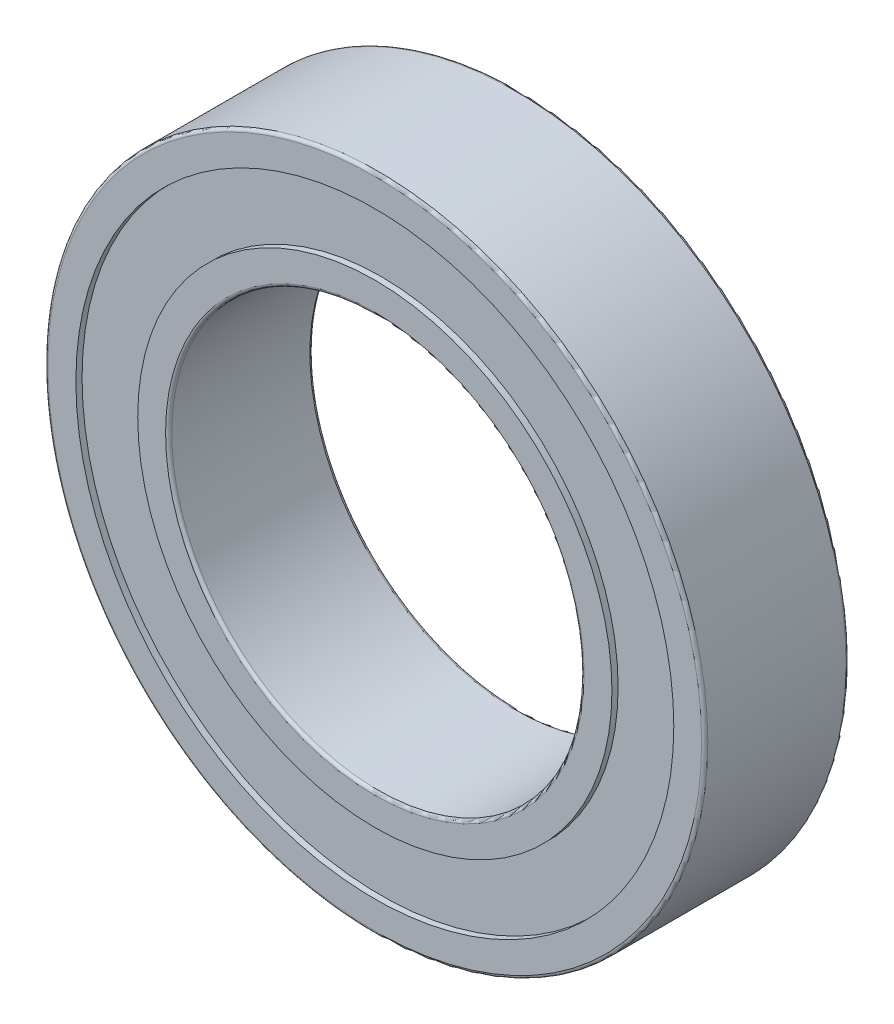
ISO-10303-21;
HEADER;
FILE_DESCRIPTION(('STEP AP214'),'2;1');
FILE_NAME('part.step','',(''),(''),'','','');
FILE_SCHEMA(('AUTOMOTIVE_DESIGN { 1 0 10303 214 1 1 1 1 }'));
ENDSEC;
DATA;
#1=APPLICATION_CONTEXT('core data for automotive mechanical design processes');
#2=APPLICATION_PROTOCOL_DEFINITION('international standard','automotive_design',2000,#1);
#3=PRODUCT_CONTEXT('',#1,'mechanical');
#4=PRODUCT('Part','Part','',(#3));
#5=PRODUCT_RELATED_PRODUCT_CATEGORY('part','',(#4));
#6=PRODUCT_DEFINITION_FORMATION('','',#4);
#7=PRODUCT_DEFINITION_CONTEXT('part definition',#1,'design');
#8=PRODUCT_DEFINITION('design','',#6,#7);
#9=PRODUCT_DEFINITION_SHAPE('','',#8);
#10=(LENGTH_UNIT() NAMED_UNIT(*) SI_UNIT(.MILLI.,.METRE.));
#11=(NAMED_UNIT(*) PLANE_ANGLE_UNIT() SI_UNIT($,.RADIAN.));
#12=(NAMED_UNIT(*) SI_UNIT($,.STERADIAN.) SOLID_ANGLE_UNIT());
#13=UNCERTAINTY_MEASURE_WITH_UNIT(LENGTH_MEASURE(1.E-05),#10,'distance_accuracy_value','');
#14=(GEOMETRIC_REPRESENTATION_CONTEXT(3) GLOBAL_UNCERTAINTY_ASSIGNED_CONTEXT((#13)) GLOBAL_UNIT_ASSIGNED_CONTEXT((#10,
#11,#12)) REPRESENTATION_CONTEXT('',''));
#15=CARTESIAN_POINT('',(0.,0.,0.));
#16=DIRECTION('',(0.,0.,1.));
#17=DIRECTION('',(1.,0.,0.));
#18=AXIS2_PLACEMENT_3D('',#15,#16,#17);
#19=CARTESIAN_POINT('',(0.,0.,0.));
#20=DIRECTION('',(0.,0.,1.));
#21=DIRECTION('',(1.,0.,0.));
#22=AXIS2_PLACEMENT_3D('',#19,#20,#21);
#23=PLANE('',#22);
#24=CARTESIAN_POINT('',(0.,0.,0.));
#25=DIRECTION('',(0.,0.,1.));
#26=DIRECTION('',(1.,0.,0.));
#27=AXIS2_PLACEMENT_3D('',#24,#25,#26);
#28=CIRCLE('',#27,10.15);
#29=CARTESIAN_POINT('',(10.15,0.,0.));
#30=VERTEX_POINT('',#29);
#31=EDGE_CURVE('E62',#30,#30,#28,.T.);
#32=ORIENTED_EDGE('',*,*,#31,.T.);
#33=EDGE_LOOP('',(#32));
#34=FACE_BOUND('',#33,.T.);
#35=CARTESIAN_POINT('',(0.,0.,0.));
#36=DIRECTION('',(0.,0.,1.));
#37=DIRECTION('',(1.,0.,0.));
#38=AXIS2_PLACEMENT_3D('',#35,#36,#37);
#39=CIRCLE('',#38,11.5);
#40=CARTESIAN_POINT('',(11.5,0.,0.));
#41=VERTEX_POINT('',#40);
#42=EDGE_CURVE('E84',#41,#41,#39,.T.);
#43=ORIENTED_EDGE('',*,*,#42,.F.);
#44=EDGE_LOOP('',(#43));
#45=FACE_BOUND('',#44,.T.);
#46=ADVANCED_FACE('F33',(#34,#45),#23,.F.);
#47=CARTESIAN_POINT('',(0.,0.,7.));
#48=DIRECTION('',(0.,0.,1.));
#49=DIRECTION('',(1.,0.,0.));
#50=AXIS2_PLACEMENT_3D('',#47,#48,#49);
#51=PLANE('',#50);
#52=CARTESIAN_POINT('',(0.,0.,7.));
#53=DIRECTION('',(0.,0.,1.));
#54=DIRECTION('',(1.,0.,0.));
#55=AXIS2_PLACEMENT_3D('',#52,#53,#54);
#56=CIRCLE('',#55,10.15);
#57=CARTESIAN_POINT('',(10.15,0.,7.));
#58=VERTEX_POINT('',#57);
#59=EDGE_CURVE('E40',#58,#58,#56,.F.);
#60=ORIENTED_EDGE('',*,*,#59,.T.);
#61=EDGE_LOOP('',(#60));
#62=FACE_BOUND('',#61,.T.);
#63=CARTESIAN_POINT('',(0.,0.,7.));
#64=DIRECTION('',(0.,0.,1.));
#65=DIRECTION('',(1.,0.,0.));
#66=AXIS2_PLACEMENT_3D('',#63,#64,#65);
#67=CIRCLE('',#66,11.5);
#68=CARTESIAN_POINT('',(11.5,0.,7.));
#69=VERTEX_POINT('',#68);
#70=EDGE_CURVE('E72',#69,#69,#67,.T.);
#71=ORIENTED_EDGE('',*,*,#70,.T.);
#72=EDGE_LOOP('',(#71));
#73=FACE_BOUND('',#72,.T.);
#74=ADVANCED_FACE('F101',(#62,#73),#51,.T.);
#75=CARTESIAN_POINT('',(0.,0.,7.));
#76=DIRECTION('',(0.,0.,1.));
#77=DIRECTION('',(1.,0.,0.));
#78=AXIS2_PLACEMENT_3D('',#75,#76,#77);
#79=CIRCLE('',#78,15.85);
#80=CARTESIAN_POINT('',(15.85,0.,7.));
#81=VERTEX_POINT('',#80);
#82=EDGE_CURVE('E10',#81,#81,#79,.T.);
#83=ORIENTED_EDGE('',*,*,#82,.T.);
#84=EDGE_LOOP('',(#83));
#85=FACE_BOUND('',#84,.T.);
#86=CARTESIAN_POINT('',(0.,0.,7.));
#87=DIRECTION('',(0.,0.,1.));
#88=DIRECTION('',(1.,0.,0.));
#89=AXIS2_PLACEMENT_3D('',#86,#87,#88);
#90=CIRCLE('',#89,14.5);
#91=CARTESIAN_POINT('',(14.5,0.,7.));
#92=VERTEX_POINT('',#91);
#93=EDGE_CURVE('E66',#92,#92,#90,.T.);
#94=ORIENTED_EDGE('',*,*,#93,.F.);
#95=EDGE_LOOP('',(#94));
#96=FACE_BOUND('',#95,.T.);
#97=ADVANCED_FACE('F108',(#85,#96),#51,.T.);
#98=CARTESIAN_POINT('',(0.,0.,0.));
#99=DIRECTION('',(0.,0.,1.));
#100=DIRECTION('',(1.,0.,0.));
#101=AXIS2_PLACEMENT_3D('',#98,#99,#100);
#102=CIRCLE('',#101,15.85);
#103=CARTESIAN_POINT('',(15.85,0.,0.));
#104=VERTEX_POINT('',#103);
#105=EDGE_CURVE('E44',#104,#104,#102,.F.);
#106=ORIENTED_EDGE('',*,*,#105,.T.);
#107=EDGE_LOOP('',(#106));
#108=FACE_BOUND('',#107,.T.);
#109=CARTESIAN_POINT('',(0.,0.,0.));
#110=DIRECTION('',(0.,0.,1.));
#111=DIRECTION('',(1.,0.,0.));
#112=AXIS2_PLACEMENT_3D('',#109,#110,#111);
#113=CIRCLE('',#112,14.5);
#114=CARTESIAN_POINT('',(14.5,0.,0.));
#115=VERTEX_POINT('',#114);
#116=EDGE_CURVE('E78',#115,#115,#113,.T.);
#117=ORIENTED_EDGE('',*,*,#116,.T.);
#118=EDGE_LOOP('',(#117));
#119=FACE_BOUND('',#118,.T.);
#120=ADVANCED_FACE('F104',(#108,#119),#23,.F.);
#121=CARTESIAN_POINT('',(0.,0.,7.));
#122=DIRECTION('',(0.,0.,-1.));
#123=DIRECTION('',(-1.,0.,0.));
#124=AXIS2_PLACEMENT_3D('',#121,#122,#123);
#125=CYLINDRICAL_SURFACE('',#124,16.);
#126=CARTESIAN_POINT('',(0.,0.,0.15));
#127=DIRECTION('',(0.,0.,1.));
#128=DIRECTION('',(1.,0.,0.));
#129=AXIS2_PLACEMENT_3D('',#126,#127,#128);
#130=CIRCLE('',#129,16.);
#131=CARTESIAN_POINT('',(16.,0.,0.15));
#132=VERTEX_POINT('',#131);
#133=EDGE_CURVE('E48',#132,#132,#130,.T.);
#134=ORIENTED_EDGE('',*,*,#133,.T.);
#135=EDGE_LOOP('',(#134));
#136=FACE_BOUND('',#135,.T.);
#137=CARTESIAN_POINT('',(0.,0.,6.85));
#138=DIRECTION('',(0.,0.,1.));
#139=DIRECTION('',(1.,0.,0.));
#140=AXIS2_PLACEMENT_3D('',#137,#138,#139);
#141=CIRCLE('',#140,16.);
#142=CARTESIAN_POINT('',(16.,0.,6.85));
#143=VERTEX_POINT('',#142);
#144=EDGE_CURVE('E53',#143,#143,#141,.F.);
#145=ORIENTED_EDGE('',*,*,#144,.T.);
#146=EDGE_LOOP('',(#145));
#147=FACE_BOUND('',#146,.T.);
#148=ADVANCED_FACE('F112',(#136,#147),#125,.T.);
#149=CARTESIAN_POINT('',(0.,0.,7.));
#150=DIRECTION('',(0.,0.,-1.));
#151=DIRECTION('',(-1.,0.,0.));
#152=AXIS2_PLACEMENT_3D('',#149,#150,#151);
#153=CYLINDRICAL_SURFACE('',#152,10.);
#154=CARTESIAN_POINT('',(0.,0.,0.15));
#155=DIRECTION('',(0.,0.,1.));
#156=DIRECTION('',(1.,0.,0.));
#157=AXIS2_PLACEMENT_3D('',#154,#155,#156);
#158=CIRCLE('',#157,10.);
#159=CARTESIAN_POINT('',(10.,0.,0.15));
#160=VERTEX_POINT('',#159);
#161=EDGE_CURVE('E56',#160,#160,#158,.F.);
#162=ORIENTED_EDGE('',*,*,#161,.T.);
#163=EDGE_LOOP('',(#162));
#164=FACE_BOUND('',#163,.T.);
#165=CARTESIAN_POINT('',(0.,0.,6.85));
#166=DIRECTION('',(0.,0.,1.));
#167=DIRECTION('',(1.,0.,0.));
#168=AXIS2_PLACEMENT_3D('',#165,#166,#167);
#169=CIRCLE('',#168,10.);
#170=CARTESIAN_POINT('',(10.,0.,6.85));
#171=VERTEX_POINT('',#170);
#172=EDGE_CURVE('E59',#171,#171,#169,.T.);
#173=ORIENTED_EDGE('',*,*,#172,.T.);
#174=EDGE_LOOP('',(#173));
#175=FACE_BOUND('',#174,.T.);
#176=ADVANCED_FACE('F118',(#164,#175),#153,.F.);
#177=CARTESIAN_POINT('',(0.,0.,6.7));
#178=DIRECTION('',(0.,0.,1.));
#179=DIRECTION('',(1.,0.,0.));
#180=AXIS2_PLACEMENT_3D('',#177,#178,#179);
#181=CYLINDRICAL_SURFACE('',#180,14.5);
#182=CARTESIAN_POINT('',(0.,0.,6.7));
#183=DIRECTION('',(0.,0.,1.));
#184=DIRECTION('',(1.,0.,0.));
#185=AXIS2_PLACEMENT_3D('',#182,#183,#184);
#186=CIRCLE('',#185,14.5);
#187=CARTESIAN_POINT('',(14.5,0.,6.7));
#188=VERTEX_POINT('',#187);
#189=EDGE_CURVE('E65',#188,#188,#186,.T.);
#190=ORIENTED_EDGE('',*,*,#189,.F.);
#191=EDGE_LOOP('',(#190));
#192=FACE_BOUND('',#191,.T.);
#193=ORIENTED_EDGE('',*,*,#93,.T.);
#194=EDGE_LOOP('',(#193));
#195=FACE_BOUND('',#194,.T.);
#196=ADVANCED_FACE('F140',(#192,#195),#181,.F.);
#197=CARTESIAN_POINT('',(0.,0.,6.7));
#198=DIRECTION('',(0.,0.,1.));
#199=DIRECTION('',(1.,0.,0.));
#200=AXIS2_PLACEMENT_3D('',#197,#198,#199);
#201=PLANE('',#200);
#202=CARTESIAN_POINT('',(0.,0.,6.7));
#203=DIRECTION('',(0.,0.,1.));
#204=DIRECTION('',(1.,0.,0.));
#205=AXIS2_PLACEMENT_3D('',#202,#203,#204);
#206=CIRCLE('',#205,11.5);
#207=CARTESIAN_POINT('',(11.5,0.,6.7));
#208=VERTEX_POINT('',#207);
#209=EDGE_CURVE('E69',#208,#208,#206,.T.);
#210=ORIENTED_EDGE('',*,*,#209,.F.);
#211=EDGE_LOOP('',(#210));
#212=FACE_BOUND('',#211,.T.);
#213=ORIENTED_EDGE('',*,*,#189,.T.);
#214=EDGE_LOOP('',(#213));
#215=FACE_BOUND('',#214,.T.);
#216=ADVANCED_FACE('F136',(#212,#215),#201,.T.);
#217=CARTESIAN_POINT('',(0.,0.,6.7));
#218=DIRECTION('',(0.,0.,1.));
#219=DIRECTION('',(1.,0.,0.));
#220=AXIS2_PLACEMENT_3D('',#217,#218,#219);
#221=CYLINDRICAL_SURFACE('',#220,11.5);
#222=ORIENTED_EDGE('',*,*,#209,.T.);
#223=EDGE_LOOP('',(#222));
#224=FACE_BOUND('',#223,.T.);
#225=ORIENTED_EDGE('',*,*,#70,.F.);
#226=EDGE_LOOP('',(#225));
#227=FACE_BOUND('',#226,.T.);
#228=ADVANCED_FACE('F130',(#224,#227),#221,.T.);
#229=CARTESIAN_POINT('',(0.,0.,0.5));
#230=DIRECTION('',(0.,0.,1.));
#231=DIRECTION('',(1.,0.,0.));
#232=AXIS2_PLACEMENT_3D('',#229,#230,#231);
#233=PLANE('',#232);
#234=CARTESIAN_POINT('',(0.,0.,0.5));
#235=DIRECTION('',(0.,0.,1.));
#236=DIRECTION('',(1.,0.,0.));
#237=AXIS2_PLACEMENT_3D('',#234,#235,#236);
#238=CIRCLE('',#237,14.5);
#239=CARTESIAN_POINT('',(14.5,0.,0.5));
#240=VERTEX_POINT('',#239);
#241=EDGE_CURVE('E75',#240,#240,#238,.T.);
#242=ORIENTED_EDGE('',*,*,#241,.F.);
#243=EDGE_LOOP('',(#242));
#244=FACE_BOUND('',#243,.T.);
#245=CARTESIAN_POINT('',(0.,0.,0.5));
#246=DIRECTION('',(0.,0.,1.));
#247=DIRECTION('',(1.,0.,0.));
#248=AXIS2_PLACEMENT_3D('',#245,#246,#247);
#249=CIRCLE('',#248,11.5);
#250=CARTESIAN_POINT('',(11.5,0.,0.5));
#251=VERTEX_POINT('',#250);
#252=EDGE_CURVE('E81',#251,#251,#249,.T.);
#253=ORIENTED_EDGE('',*,*,#252,.T.);
#254=EDGE_LOOP('',(#253));
#255=FACE_BOUND('',#254,.T.);
#256=ADVANCED_FACE('F90',(#244,#255),#233,.F.);
#257=CARTESIAN_POINT('',(0.,0.,0.5));
#258=DIRECTION('',(0.,0.,-1.));
#259=DIRECTION('',(-1.,0.,0.));
#260=AXIS2_PLACEMENT_3D('',#257,#258,#259);
#261=CYLINDRICAL_SURFACE('',#260,14.5);
#262=ORIENTED_EDGE('',*,*,#241,.T.);
#263=EDGE_LOOP('',(#262));
#264=FACE_BOUND('',#263,.T.);
#265=ORIENTED_EDGE('',*,*,#116,.F.);
#266=EDGE_LOOP('',(#265));
#267=FACE_BOUND('',#266,.T.);
#268=ADVANCED_FACE('F96',(#264,#267),#261,.F.);
#269=CARTESIAN_POINT('',(0.,0.,0.5));
#270=DIRECTION('',(0.,0.,-1.));
#271=DIRECTION('',(-1.,0.,0.));
#272=AXIS2_PLACEMENT_3D('',#269,#270,#271);
#273=CYLINDRICAL_SURFACE('',#272,11.5);
#274=ORIENTED_EDGE('',*,*,#252,.F.);
#275=EDGE_LOOP('',(#274));
#276=FACE_BOUND('',#275,.T.);
#277=ORIENTED_EDGE('',*,*,#42,.T.);
#278=EDGE_LOOP('',(#277));
#279=FACE_BOUND('',#278,.T.);
#280=ADVANCED_FACE('F92',(#276,#279),#273,.T.);
#281=CARTESIAN_POINT('',(0.,0.,0.15));
#282=DIRECTION('',(0.,0.,1.));
#283=DIRECTION('',(1.,0.,0.));
#284=AXIS2_PLACEMENT_3D('',#281,#282,#283);
#285=TOROIDAL_SURFACE('',#284,10.15,0.15);
#286=ORIENTED_EDGE('',*,*,#161,.F.);
#287=EDGE_LOOP('',(#286));
#288=FACE_BOUND('',#287,.T.);
#289=ORIENTED_EDGE('',*,*,#31,.F.);
#290=EDGE_LOOP('',(#289));
#291=FACE_BOUND('',#290,.T.);
#292=ADVANCED_FACE('F95',(#288,#291),#285,.T.);
#293=CARTESIAN_POINT('',(0.,0.,0.15));
#294=DIRECTION('',(0.,0.,1.));
#295=DIRECTION('',(1.,0.,0.));
#296=AXIS2_PLACEMENT_3D('',#293,#294,#295);
#297=TOROIDAL_SURFACE('',#296,15.85,0.15);
#298=ORIENTED_EDGE('',*,*,#105,.F.);
#299=EDGE_LOOP('',(#298));
#300=FACE_BOUND('',#299,.T.);
#301=ORIENTED_EDGE('',*,*,#133,.F.);
#302=EDGE_LOOP('',(#301));
#303=FACE_BOUND('',#302,.T.);
#304=ADVANCED_FACE('F155',(#300,#303),#297,.T.);
#305=CARTESIAN_POINT('',(0.,0.,6.85));
#306=DIRECTION('',(0.,0.,1.));
#307=DIRECTION('',(1.,0.,0.));
#308=AXIS2_PLACEMENT_3D('',#305,#306,#307);
#309=TOROIDAL_SURFACE('',#308,10.15,0.15);
#310=ORIENTED_EDGE('',*,*,#59,.F.);
#311=EDGE_LOOP('',(#310));
#312=FACE_BOUND('',#311,.T.);
#313=ORIENTED_EDGE('',*,*,#172,.F.);
#314=EDGE_LOOP('',(#313));
#315=FACE_BOUND('',#314,.T.);
#316=ADVANCED_FACE('F153',(#312,#315),#309,.T.);
#317=CARTESIAN_POINT('',(0.,0.,6.85));
#318=DIRECTION('',(0.,0.,1.));
#319=DIRECTION('',(1.,0.,0.));
#320=AXIS2_PLACEMENT_3D('',#317,#318,#319);
#321=TOROIDAL_SURFACE('',#320,15.85,0.15);
#322=ORIENTED_EDGE('',*,*,#144,.F.);
#323=EDGE_LOOP('',(#322));
#324=FACE_BOUND('',#323,.T.);
#325=ORIENTED_EDGE('',*,*,#82,.F.);
#326=EDGE_LOOP('',(#325));
#327=FACE_BOUND('',#326,.T.);
#328=ADVANCED_FACE('F35',(#324,#327),#321,.T.);
#329=CLOSED_SHELL('',(#46,#74,#97,#120,#148,#176,#196,#216,#228,#256,#268,#280,#292,#304,#316,#328));
#330=MANIFOLD_SOLID_BREP('B2',#329);
#331=ADVANCED_BREP_SHAPE_REPRESENTATION('',(#18,#330),#14);
#332=SHAPE_DEFINITION_REPRESENTATION(#9,#331);
ENDSEC;
END-ISO-10303-21;
